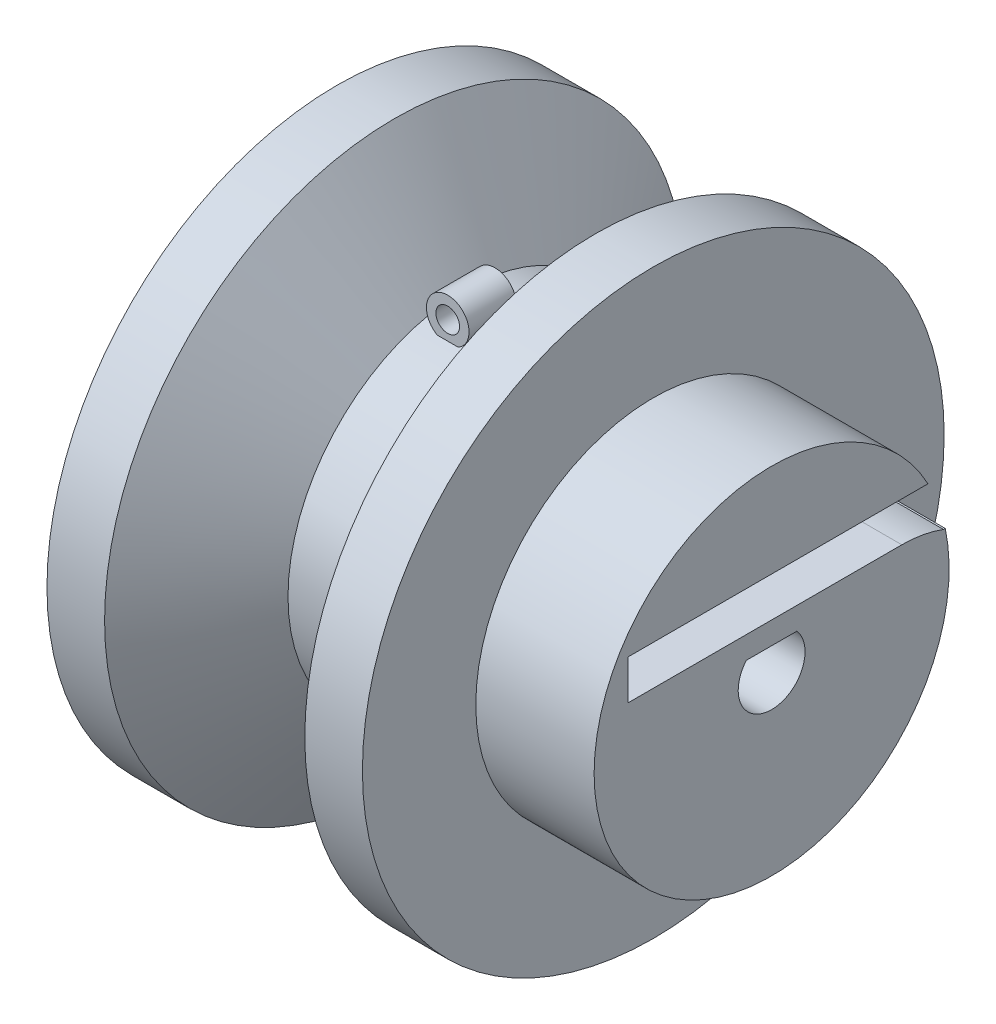
ISO-10303-21;
HEADER;
FILE_DESCRIPTION(('STEP AP214'),'2;1');
FILE_NAME('part.step','',(''),(''),'','','');
FILE_SCHEMA(('AUTOMOTIVE_DESIGN { 1 0 10303 214 1 1 1 1 }'));
ENDSEC;
DATA;
#1=APPLICATION_CONTEXT('core data for automotive mechanical design processes');
#2=APPLICATION_PROTOCOL_DEFINITION('international standard','automotive_design',2000,#1);
#3=PRODUCT_CONTEXT('',#1,'mechanical');
#4=PRODUCT('Part','Part','',(#3));
#5=PRODUCT_RELATED_PRODUCT_CATEGORY('part','',(#4));
#6=PRODUCT_DEFINITION_FORMATION('','',#4);
#7=PRODUCT_DEFINITION_CONTEXT('part definition',#1,'design');
#8=PRODUCT_DEFINITION('design','',#6,#7);
#9=PRODUCT_DEFINITION_SHAPE('','',#8);
#10=(LENGTH_UNIT() NAMED_UNIT(*) SI_UNIT(.MILLI.,.METRE.));
#11=(NAMED_UNIT(*) PLANE_ANGLE_UNIT() SI_UNIT($,.RADIAN.));
#12=(NAMED_UNIT(*) SI_UNIT($,.STERADIAN.) SOLID_ANGLE_UNIT());
#13=UNCERTAINTY_MEASURE_WITH_UNIT(LENGTH_MEASURE(1.E-05),#10,'distance_accuracy_value','');
#14=(GEOMETRIC_REPRESENTATION_CONTEXT(3) GLOBAL_UNCERTAINTY_ASSIGNED_CONTEXT((#13)) GLOBAL_UNIT_ASSIGNED_CONTEXT((#10,
#11,#12)) REPRESENTATION_CONTEXT('',''));
#15=CARTESIAN_POINT('',(0.,0.,0.));
#16=DIRECTION('',(0.,0.,1.));
#17=DIRECTION('',(1.,0.,0.));
#18=AXIS2_PLACEMENT_3D('',#15,#16,#17);
#19=CARTESIAN_POINT('',(27.74,0.,0.));
#20=DIRECTION('',(1.,0.,0.));
#21=DIRECTION('',(0.,0.,-1.));
#22=AXIS2_PLACEMENT_3D('',#19,#20,#21);
#23=PLANE('',#22);
#24=DIRECTION('',(0.,-1.,0.));
#25=VECTOR('',#24,1.);
#26=CARTESIAN_POINT('',(27.74,7.09824209919004,12.1510601448769));
#27=LINE('',#26,#25);
#28=CARTESIAN_POINT('',(27.74,7.09824209919004,12.1510601448769));
#29=VERTEX_POINT('',#28);
#30=CARTESIAN_POINT('',(27.74,3.73881264693587,12.1510601448769));
#31=VERTEX_POINT('',#30);
#32=EDGE_CURVE('E265',#29,#31,#27,.T.);
#33=ORIENTED_EDGE('',*,*,#32,.T.);
#34=DIRECTION('',(0.,0.,1.));
#35=VECTOR('',#34,1.);
#36=CARTESIAN_POINT('',(27.74,3.73881264693587,12.1510601448769));
#37=LINE('',#36,#35);
#38=CARTESIAN_POINT('',(27.74,3.73881264693587,-11.0050547500701));
#39=VERTEX_POINT('',#38);
#40=EDGE_CURVE('E322',#39,#31,#37,.T.);
#41=ORIENTED_EDGE('',*,*,#40,.F.);
#42=CARTESIAN_POINT('',(27.74,-6.26118735306413,-11.0050547500701));
#43=DIRECTION('',(1.,0.,0.));
#44=DIRECTION('',(0.,0.,-1.));
#45=AXIS2_PLACEMENT_3D('',#42,#43,#44);
#46=CIRCLE('',#45,10.);
#47=CARTESIAN_POINT('',(27.74,3.09824209919004,-14.5265715153684));
#48=VERTEX_POINT('',#47);
#49=EDGE_CURVE('E12',#39,#48,#46,.F.);
#50=ORIENTED_EDGE('',*,*,#49,.T.);
#51=DIRECTION('',(0.,0.,-1.));
#52=VECTOR('',#51,1.);
#53=CARTESIAN_POINT('',(27.74,3.09824209919004,12.1510601448769));
#54=LINE('',#53,#52);
#55=CARTESIAN_POINT('',(27.74,3.09824209919004,-14.6765423685147));
#56=VERTEX_POINT('',#55);
#57=EDGE_CURVE('E60',#48,#56,#54,.T.);
#58=ORIENTED_EDGE('',*,*,#57,.T.);
#59=CARTESIAN_POINT('',(27.74,0.,0.));
#60=DIRECTION('',(1.,0.,0.));
#61=DIRECTION('',(0.,0.,-1.));
#62=AXIS2_PLACEMENT_3D('',#59,#60,#61);
#63=CIRCLE('',#62,15.);
#64=CARTESIAN_POINT('',(27.74,3.73881264693587,-14.5265715153684));
#65=VERTEX_POINT('',#64);
#66=EDGE_CURVE('E132',#56,#65,#63,.T.);
#67=ORIENTED_EDGE('',*,*,#66,.T.);
#68=CARTESIAN_POINT('',(27.74,7.09824209919004,-13.2141953633691));
#69=VERTEX_POINT('',#68);
#70=EDGE_CURVE('E251',#65,#69,#63,.T.);
#71=ORIENTED_EDGE('',*,*,#70,.T.);
#72=DIRECTION('',(0.,0.,1.));
#73=VECTOR('',#72,1.);
#74=CARTESIAN_POINT('',(27.74,7.09824209919004,12.1510601448769));
#75=LINE('',#74,#73);
#76=EDGE_CURVE('E256',#69,#29,#75,.T.);
#77=ORIENTED_EDGE('',*,*,#76,.T.);
#78=EDGE_LOOP('',(#33,#41,#50,#58,#67,#71,#77));
#79=FACE_BOUND('',#78,.T.);
#80=ADVANCED_FACE('F45',(#79),#23,.T.);
#81=CARTESIAN_POINT('',(27.74,3.09824209919004,12.1510601448769));
#82=DIRECTION('',(0.,-1.,0.));
#83=DIRECTION('',(0.,0.,-1.));
#84=AXIS2_PLACEMENT_3D('',#81,#82,#83);
#85=PLANE('',#84);
#86=DIRECTION('',(-1.,0.,0.));
#87=VECTOR('',#86,1.);
#88=CARTESIAN_POINT('',(36.74,3.09824209919004,-14.5265715153684));
#89=LINE('',#88,#87);
#90=CARTESIAN_POINT('',(36.74,3.09824209919004,-14.5265715153684));
#91=VERTEX_POINT('',#90);
#92=EDGE_CURVE('E315',#91,#48,#89,.T.);
#93=ORIENTED_EDGE('',*,*,#92,.F.);
#94=DIRECTION('',(0.,0.,-1.));
#95=VECTOR('',#94,1.);
#96=CARTESIAN_POINT('',(36.74,3.09824209919004,12.1510601448769));
#97=LINE('',#96,#95);
#98=CARTESIAN_POINT('',(36.74,3.09824209919004,-14.6765423685147));
#99=VERTEX_POINT('',#98);
#100=EDGE_CURVE('E266',#91,#99,#97,.T.);
#101=ORIENTED_EDGE('',*,*,#100,.T.);
#102=DIRECTION('',(1.,0.,0.));
#103=VECTOR('',#102,1.);
#104=CARTESIAN_POINT('',(27.74,3.09824209919004,-14.6765423685147));
#105=LINE('',#104,#103);
#106=EDGE_CURVE('E273',#56,#99,#105,.T.);
#107=ORIENTED_EDGE('',*,*,#106,.F.);
#108=ORIENTED_EDGE('',*,*,#57,.F.);
#109=EDGE_LOOP('',(#93,#101,#107,#108));
#110=FACE_BOUND('',#109,.T.);
#111=ADVANCED_FACE('F167',(#110),#85,.F.);
#112=CARTESIAN_POINT('',(27.74,7.09824209919004,12.1510601448769));
#113=DIRECTION('',(0.,0.,1.));
#114=DIRECTION('',(1.,0.,0.));
#115=AXIS2_PLACEMENT_3D('',#112,#113,#114);
#116=PLANE('',#115);
#117=DIRECTION('',(-1.,0.,0.));
#118=VECTOR('',#117,1.);
#119=CARTESIAN_POINT('',(36.74,3.73881264693587,12.1510601448769));
#120=LINE('',#119,#118);
#121=CARTESIAN_POINT('',(36.74,3.73881264693587,12.1510601448769));
#122=VERTEX_POINT('',#121);
#123=EDGE_CURVE('E318',#122,#31,#120,.T.);
#124=ORIENTED_EDGE('',*,*,#123,.T.);
#125=ORIENTED_EDGE('',*,*,#32,.F.);
#126=DIRECTION('',(1.,0.,0.));
#127=VECTOR('',#126,1.);
#128=CARTESIAN_POINT('',(27.74,7.09824209919004,12.1510601448769));
#129=LINE('',#128,#127);
#130=CARTESIAN_POINT('',(36.74,7.09824209919004,12.1510601448769));
#131=VERTEX_POINT('',#130);
#132=EDGE_CURVE('E263',#29,#131,#129,.T.);
#133=ORIENTED_EDGE('',*,*,#132,.T.);
#134=DIRECTION('',(0.,-1.,0.));
#135=VECTOR('',#134,1.);
#136=CARTESIAN_POINT('',(36.74,7.09824209919004,12.1510601448769));
#137=LINE('',#136,#135);
#138=EDGE_CURVE('E300',#131,#122,#137,.T.);
#139=ORIENTED_EDGE('',*,*,#138,.T.);
#140=EDGE_LOOP('',(#124,#125,#133,#139));
#141=FACE_BOUND('',#140,.T.);
#142=ADVANCED_FACE('F171',(#141),#116,.F.);
#143=CARTESIAN_POINT('',(-743.156397809563,0.,0.));
#144=DIRECTION('',(-1.,0.,0.));
#145=DIRECTION('',(0.,0.,1.));
#146=AXIS2_PLACEMENT_3D('',#143,#144,#145);
#147=CYLINDRICAL_SURFACE('',#146,15.);
#148=CARTESIAN_POINT('',(15.8700000000001,0.,0.));
#149=DIRECTION('',(-1.,0.,0.));
#150=DIRECTION('',(0.,0.,1.));
#151=AXIS2_PLACEMENT_3D('',#148,#149,#150);
#152=CIRCLE('',#151,15.);
#153=CARTESIAN_POINT('',(15.8700000000001,0.,15.));
#154=VERTEX_POINT('',#153);
#155=EDGE_CURVE('E220',#154,#154,#152,.T.);
#156=ORIENTED_EDGE('',*,*,#155,.T.);
#157=EDGE_LOOP('',(#156));
#158=FACE_BOUND('',#157,.T.);
#159=CARTESIAN_POINT('',(10.87,0.,0.));
#160=DIRECTION('',(-1.,0.,0.));
#161=DIRECTION('',(0.,0.,1.));
#162=AXIS2_PLACEMENT_3D('',#159,#160,#161);
#163=CIRCLE('',#162,15.);
#164=CARTESIAN_POINT('',(10.87,0.,15.));
#165=VERTEX_POINT('',#164);
#166=EDGE_CURVE('E226',#165,#165,#163,.T.);
#167=ORIENTED_EDGE('',*,*,#166,.F.);
#168=EDGE_LOOP('',(#167));
#169=FACE_BOUND('',#168,.T.);
#170=DIRECTION('',(-1.,0.,0.));
#171=VECTOR('',#170,1.);
#172=CARTESIAN_POINT('',(-743.156397809563,15.,0.));
#173=LINE('',#172,#171);
#174=CARTESIAN_POINT('',(14.8504583116479,15.,0.));
#175=VERTEX_POINT('',#174);
#176=CARTESIAN_POINT('',(11.8895416883522,15.,0.));
#177=VERTEX_POINT('',#176);
#178=EDGE_CURVE('E144',#175,#177,#173,.T.);
#179=ORIENTED_EDGE('',*,*,#178,.F.);
#180=CARTESIAN_POINT('',(14.4196866255922,14.5615933194139,-3.6));
#181=CARTESIAN_POINT('',(14.4357733459285,14.5731456355853,-3.55327410404818));
#182=CARTESIAN_POINT('',(14.4510818867125,14.5845327262907,-3.50624724967474));
#183=CARTESIAN_POINT('',(14.4802932805511,14.6069428594248,-3.41168258013151));
#184=CARTESIAN_POINT('',(14.4941964015871,14.617965970985,-3.36414486429099));
#185=CARTESIAN_POINT('',(14.534009145234,14.6504266284674,-3.22095805424617));
#186=CARTESIAN_POINT('',(14.5580496378074,14.6712757325477,-3.12465360524271));
#187=CARTESIAN_POINT('',(14.6019926339957,14.7111796475416,-2.93103098705327));
#188=CARTESIAN_POINT('',(14.6219057918556,14.7302390070361,-2.83371612646438));
#189=CARTESIAN_POINT('',(14.6583436782672,14.7665277583274,-2.63809805101602));
#190=CARTESIAN_POINT('',(14.6748675652217,14.783756695097,-2.53979459701827));
#191=CARTESIAN_POINT('',(14.7202890144841,14.8327309935113,-2.24286251660221));
#192=CARTESIAN_POINT('',(14.7448495147132,14.8615835104745,-2.04308407583506));
#193=CARTESIAN_POINT('',(14.7853552250568,14.9112821235563,-1.64154236759657));
#194=CARTESIAN_POINT('',(14.8012929445319,14.932121253888,-1.43977752893685));
#195=CARTESIAN_POINT('',(14.8241201509908,14.9627865618332,-1.06933809275482));
#196=CARTESIAN_POINT('',(14.8320833390896,14.9738784677839,-0.900831426121393));
#197=CARTESIAN_POINT('',(14.8437857630441,14.9903684014082,-0.563378108900227));
#198=CARTESIAN_POINT('',(14.8475245782457,14.9957658620372,-0.39443141617424));
#199=CARTESIAN_POINT('',(14.8510475053307,15.0008481000002,-0.0562911462323061));
#200=CARTESIAN_POINT('',(14.8508287793075,15.0005287778977,0.112902521146719));
#201=CARTESIAN_POINT('',(14.8464137659677,14.9941687050334,0.451121332644292));
#202=CARTESIAN_POINT('',(14.8422177235624,14.9881283065585,0.620146486497868));
#203=CARTESIAN_POINT('',(14.8295497828135,14.9703508064537,0.957677724063648));
#204=CARTESIAN_POINT('',(14.8210794451633,14.9586157841884,1.12618397466693));
#205=CARTESIAN_POINT('',(14.7992489937467,14.9294971643141,1.46238790541403));
#206=CARTESIAN_POINT('',(14.7858891877359,14.9121139222262,1.63008563577523));
#207=CARTESIAN_POINT('',(14.7533014497415,14.8718181714802,1.96399131090327));
#208=CARTESIAN_POINT('',(14.734082434664,14.8489140758102,2.13020112713187));
#209=CARTESIAN_POINT('',(14.6882736430643,14.7977265549024,2.46073552471884));
#210=CARTESIAN_POINT('',(14.6616871265857,14.7694455106425,2.62506090650605));
#211=CARTESIAN_POINT('',(14.6121293611745,14.7208605118612,2.88191261487692));
#212=CARTESIAN_POINT('',(14.5923920189749,14.7022476730537,2.97538575717802));
#213=CARTESIAN_POINT('',(14.5490457514022,14.6634323901987,3.16113071557196));
#214=CARTESIAN_POINT('',(14.5254360590606,14.6432296316604,3.25340228976305));
#215=CARTESIAN_POINT('',(14.4736438573016,14.6014901133968,3.43587025869111));
#216=CARTESIAN_POINT('',(14.4454833495709,14.579960065913,3.52607436544581));
#217=CARTESIAN_POINT('',(14.3834124892646,14.5357336262286,3.70416635284676));
#218=CARTESIAN_POINT('',(14.3495057749706,14.5130379783405,3.79205565870366));
#219=CARTESIAN_POINT('',(14.2816632781307,14.4713782459583,3.94770627141876));
#220=CARTESIAN_POINT('',(14.2490147605012,14.4525465348298,4.0160587569922));
#221=CARTESIAN_POINT('',(14.1776736014055,14.4147066922762,4.14982705511399));
#222=CARTESIAN_POINT('',(14.1389636389636,14.3956982068336,4.2152337379752));
#223=CARTESIAN_POINT('',(14.053496716524,14.3579883612102,4.34195676302697));
#224=CARTESIAN_POINT('',(14.0066493318362,14.3392933633049,4.40321505127815));
#225=CARTESIAN_POINT('',(13.9031280258792,14.303734624538,4.51737619906335));
#226=CARTESIAN_POINT('',(13.846508047841,14.2868616167521,4.57032202941811));
#227=CARTESIAN_POINT('',(13.7538071876932,14.2649614250336,4.63804211187079));
#228=CARTESIAN_POINT('',(13.7222225498666,14.2583171304529,4.65840748477789));
#229=CARTESIAN_POINT('',(13.6562774506016,14.2464328041472,4.69462577561884));
#230=CARTESIAN_POINT('',(13.621918209352,14.2411921594685,4.71048066340542));
#231=CARTESIAN_POINT('',(13.5504019857745,14.2325355008809,4.73657354696612));
#232=CARTESIAN_POINT('',(13.5132175374748,14.2291410046089,4.74674533966798));
#233=CARTESIAN_POINT('',(13.4374766421934,14.2247048043685,4.76002375755702));
#234=CARTESIAN_POINT('',(13.3989221584986,14.2236598614183,4.76314010907888));
#235=CARTESIAN_POINT('',(13.3265433801891,14.2240416844005,4.76199912942318));
#236=CARTESIAN_POINT('',(13.2927014760983,14.2251894584282,4.75857410952));
#237=CARTESIAN_POINT('',(13.2261282537126,14.2292858549023,4.74631066930553));
#238=CARTESIAN_POINT('',(13.1933977538552,14.2322357753385,4.73746834718721));
#239=CARTESIAN_POINT('',(13.1211769970377,14.2406540659488,4.7121111450922));
#240=CARTESIAN_POINT('',(13.0822476287741,14.2465873657808,4.69416928782727));
#241=CARTESIAN_POINT('',(13.0079220608542,14.260223210777,4.65258152523016));
#242=CARTESIAN_POINT('',(12.9725332261644,14.2679293382855,4.62892406548383));
#243=CARTESIAN_POINT('',(12.8847486219253,14.2895789372695,4.56177638610586));
#244=CARTESIAN_POINT('',(12.835136679505,14.3044609626683,4.51498763066536));
#245=CARTESIAN_POINT('',(12.743567487068,14.335664733547,4.41491719805999));
#246=CARTESIAN_POINT('',(12.701631614679,14.3519903174951,4.36161805693269));
#247=CARTESIAN_POINT('',(12.6233877354781,14.3854233287487,4.2500634129974));
#248=CARTESIAN_POINT('',(12.5871735150634,14.402538807598,4.19174558982209));
#249=CARTESIAN_POINT('',(12.5198688154969,14.4367955791711,4.07219972382445));
#250=CARTESIAN_POINT('',(12.4887837574,14.4539368801275,4.01096868892336));
#251=CARTESIAN_POINT('',(12.4307756097092,14.4879377181199,3.88636597281732));
#252=CARTESIAN_POINT('',(12.4038603287389,14.5047966750173,3.82299053981944));
#253=CARTESIAN_POINT('',(12.3535581461621,14.5379871897917,3.6947687926762));
#254=CARTESIAN_POINT('',(12.3301697500174,14.5543189687445,3.62992311503232));
#255=CARTESIAN_POINT('',(12.2753494471734,14.5943593022677,3.46625127093833));
#256=CARTESIAN_POINT('',(12.2457718561926,14.617656382878,3.36670461770813));
#257=CARTESIAN_POINT('',(12.1918923665254,14.6624835793699,3.16578371416132));
#258=CARTESIAN_POINT('',(12.1675928786928,14.6840128850126,3.06440865149127));
#259=CARTESIAN_POINT('',(12.1232668895811,14.7251564150388,2.86018087887823));
#260=CARTESIAN_POINT('',(12.1032471176801,14.7447675975036,2.75732610934127));
#261=CARTESIAN_POINT('',(12.0667974784765,14.7819295338732,2.55060724695809));
#262=CARTESIAN_POINT('',(12.0503681883555,14.7994799562947,2.4467429946331));
#263=CARTESIAN_POINT('',(12.0054117988238,14.8491327088046,2.13268390490919));
#264=CARTESIAN_POINT('',(11.9814780057331,14.8779771692141,1.92130520353029));
#265=CARTESIAN_POINT('',(11.9427220872583,14.9266483223394,1.49692522716866));
#266=CARTESIAN_POINT('',(11.9278921176987,14.9464827745529,1.28392550959538));
#267=CARTESIAN_POINT('',(11.907952155789,14.9737758578702,0.902442311576138));
#268=CARTESIAN_POINT('',(11.9014438057765,14.9829716196496,0.734151667077948));
#269=CARTESIAN_POINT('',(11.8925128386671,14.9956870181089,0.397230797384605));
#270=CARTESIAN_POINT('',(11.8900906331622,14.999206082981,0.228600539693301));
#271=CARTESIAN_POINT('',(11.8891578517171,15.0005551932647,-0.108920039445438));
#272=CARTESIAN_POINT('',(11.8906525557944,14.9983775594991,-0.277810404903986));
#273=CARTESIAN_POINT('',(11.8976714953338,14.9883245511582,-0.615328177293033));
#274=CARTESIAN_POINT('',(11.9031954494973,14.9804495743383,-0.783955601756987));
#275=CARTESIAN_POINT('',(11.9186031445197,14.9591218424272,-1.1192168677703));
#276=CARTESIAN_POINT('',(11.9284493676455,14.9457171449308,-1.28585545956366));
#277=CARTESIAN_POINT('',(11.9531985053103,14.9133913628383,-1.61821739119074));
#278=CARTESIAN_POINT('',(11.9681010247495,14.8944707092763,-1.78394080150894));
#279=CARTESIAN_POINT('',(12.0040418346158,14.8512557634159,-2.1137196110568));
#280=CARTESIAN_POINT('',(12.0250690881903,14.8269711558943,-2.27777746608642));
#281=CARTESIAN_POINT('',(12.0749081604676,14.7731989837949,-2.60381323195979));
#282=CARTESIAN_POINT('',(12.1037157789666,14.7437142294701,-2.76579221579594));
#283=CARTESIAN_POINT('',(12.1497886574595,14.7004505854281,-2.98331277780519));
#284=CARTESIAN_POINT('',(12.1625451980696,14.6887806656528,-3.04024374783667));
#285=CARTESIAN_POINT('',(12.1895359675838,14.6648557581363,-3.15362650436627));
#286=CARTESIAN_POINT('',(12.2037700368106,14.6526008336941,-3.21007834193263));
#287=CARTESIAN_POINT('',(12.2339234510703,14.6275147826492,-3.32251911212986));
#288=CARTESIAN_POINT('',(12.2498458100237,14.6146826499476,-3.37850701779111));
#289=CARTESIAN_POINT('',(12.2835937750028,14.5885079767889,-3.48980115988623));
#290=CARTESIAN_POINT('',(12.3014198876024,14.5751653010894,-3.54510721049505));
#291=CARTESIAN_POINT('',(12.3203133744079,14.5615933194139,-3.60000000000001));
#292=B_SPLINE_CURVE_WITH_KNOTS('',3,(#180,#181,#182,#183,#184,#185,#186,#187,#188,#189,#190,
#191,#192,#193,#194,#195,#196,#197,#198,#199,#200,#201,#202,#203,#204,#205,#206,#207,#208,#209,
#210,#211,#212,#213,#214,#215,#216,#217,#218,#219,#220,#221,#222,#223,#224,#225,#226,#227,#228,
#229,#230,#231,#232,#233,#234,#235,#236,#237,#238,#239,#240,#241,#242,#243,#244,#245,#246,#247,
#248,#249,#250,#251,#252,#253,#254,#255,#256,#257,#258,#259,#260,#261,#262,#263,#264,#265,#266,
#267,#268,#269,#270,#271,#272,#273,#274,#275,#276,#277,#278,#279,#280,#281,#282,#283,#284,#285,
#286,#287,#288,#289,#290,#291),.UNSPECIFIED.,.F.,.F.,(4,2,2,2,2,2,2,2,2,2,2,2,2,2,2,2,2,2,2,2,2,
2,2,2,2,2,2,2,2,2,2,2,2,2,2,2,2,2,2,2,2,2,2,2,2,2,2,2,2,2,2,2,2,2,2,4),(0.,0.152231087412707,
0.304433092888874,0.608571886148284,0.911915523369458,1.21533439358123,1.8248948761157,
2.43498403915777,2.94201027403547,3.44908699308285,3.95652734534077,4.46393645297392,
4.97116042186448,5.47835247027026,5.98477646337416,6.49097672590164,6.78289168353585,
7.07486452864415,7.36546583771055,7.65588383174659,7.88983944187351,8.12447622435749,
8.36191003005974,8.59807286668877,8.71225729703896,8.82639178308892,8.94182950224893,
9.05710798666945,9.1586861697069,9.26033760048964,9.38943463515293,9.51879486322006,
9.72701473586305,9.93580595324616,10.1477270024573,10.3598706176915,10.5724068272348,
10.7848527186724,11.1039215172717,11.4231357503452,11.7428482794019,12.0626121655265,
12.7061331919394,13.3490989568068,13.8549572472993,14.3608664891818,14.867458050437,
15.3740142478154,15.876257843219,16.3784622022561,16.8797671226675,17.3808019543838,
17.5592793268888,17.7377374313018,17.9165196595065,18.0953495793641),.UNSPECIFIED.);
#293=CARTESIAN_POINT('',(14.2557170803749,14.456832294801,4.));
#294=VERTEX_POINT('',#293);
#295=EDGE_CURVE('E137',#175,#294,#292,.T.);
#296=ORIENTED_EDGE('',*,*,#295,.T.);
#297=DIRECTION('',(-1.,0.,0.));
#298=VECTOR('',#297,1.);
#299=CARTESIAN_POINT('',(-743.156397809563,14.456832294801,4.));
#300=LINE('',#299,#298);
#301=CARTESIAN_POINT('',(12.4842829196252,14.456832294801,4.));
#302=VERTEX_POINT('',#301);
#303=EDGE_CURVE('E123',#294,#302,#300,.T.);
#304=ORIENTED_EDGE('',*,*,#303,.T.);
#305=EDGE_CURVE('E131',#302,#177,#292,.T.);
#306=ORIENTED_EDGE('',*,*,#305,.T.);
#307=EDGE_LOOP('',(#179,#296,#304,#306));
#308=FACE_BOUND('',#307,.T.);
#309=ADVANCED_FACE('F143',(#158,#169,#308),#147,.T.);
#310=CARTESIAN_POINT('',(0.,0.,0.));
#311=DIRECTION('',(1.,0.,0.));
#312=DIRECTION('',(0.,0.,-1.));
#313=AXIS2_PLACEMENT_3D('',#310,#311,#312);
#314=PLANE('',#313);
#315=CARTESIAN_POINT('',(0.,0.,0.));
#316=DIRECTION('',(-1.,0.,0.));
#317=DIRECTION('',(0.,0.,1.));
#318=AXIS2_PLACEMENT_3D('',#315,#316,#317);
#319=CIRCLE('',#318,24.5);
#320=CARTESIAN_POINT('',(0.,0.,24.5));
#321=VERTEX_POINT('',#320);
#322=EDGE_CURVE('E238',#321,#321,#319,.T.);
#323=ORIENTED_EDGE('',*,*,#322,.T.);
#324=EDGE_LOOP('',(#323));
#325=FACE_BOUND('',#324,.T.);
#326=ADVANCED_FACE('F431',(#325),#314,.F.);
#327=CARTESIAN_POINT('',(-743.156397809563,0.,0.));
#328=DIRECTION('',(-1.,0.,0.));
#329=DIRECTION('',(0.,0.,1.));
#330=AXIS2_PLACEMENT_3D('',#327,#328,#329);
#331=CYLINDRICAL_SURFACE('',#330,24.5);
#332=ORIENTED_EDGE('',*,*,#322,.F.);
#333=EDGE_LOOP('',(#332));
#334=FACE_BOUND('',#333,.T.);
#335=CARTESIAN_POINT('',(4.87000000000004,0.,0.));
#336=DIRECTION('',(-1.,0.,0.));
#337=DIRECTION('',(0.,0.,1.));
#338=AXIS2_PLACEMENT_3D('',#335,#336,#337);
#339=CIRCLE('',#338,24.5);
#340=CARTESIAN_POINT('',(4.87000000000004,0.,24.5));
#341=VERTEX_POINT('',#340);
#342=EDGE_CURVE('E235',#341,#341,#339,.T.);
#343=ORIENTED_EDGE('',*,*,#342,.T.);
#344=EDGE_LOOP('',(#343));
#345=FACE_BOUND('',#344,.T.);
#346=ADVANCED_FACE('F215',(#334,#345),#331,.T.);
#347=CARTESIAN_POINT('',(10.87,0.,0.));
#348=DIRECTION('',(-1.,0.,0.));
#349=DIRECTION('',(0.,0.,1.));
#350=AXIS2_PLACEMENT_3D('',#347,#348,#349);
#351=CONICAL_SURFACE('',#350,15.,1.00748006530293);
#352=ORIENTED_EDGE('',*,*,#342,.F.);
#353=EDGE_LOOP('',(#352));
#354=FACE_BOUND('',#353,.T.);
#355=ORIENTED_EDGE('',*,*,#166,.T.);
#356=EDGE_LOOP('',(#355));
#357=FACE_BOUND('',#356,.T.);
#358=ADVANCED_FACE('F210',(#354,#357),#351,.T.);
#359=CARTESIAN_POINT('',(21.8699999999999,0.,0.));
#360=DIRECTION('',(1.,0.,0.));
#361=DIRECTION('',(0.,0.,-1.));
#362=AXIS2_PLACEMENT_3D('',#359,#360,#361);
#363=CONICAL_SURFACE('',#362,24.5811415525114,1.01131287661842);
#364=ORIENTED_EDGE('',*,*,#155,.F.);
#365=EDGE_LOOP('',(#364));
#366=FACE_BOUND('',#365,.T.);
#367=CARTESIAN_POINT('',(21.8699999999999,0.,0.));
#368=DIRECTION('',(-1.,0.,0.));
#369=DIRECTION('',(0.,0.,1.));
#370=AXIS2_PLACEMENT_3D('',#367,#368,#369);
#371=CIRCLE('',#370,24.5811415525114);
#372=CARTESIAN_POINT('',(21.8699999999999,0.,24.5811415525114));
#373=VERTEX_POINT('',#372);
#374=EDGE_CURVE('E223',#373,#373,#371,.T.);
#375=ORIENTED_EDGE('',*,*,#374,.T.);
#376=EDGE_LOOP('',(#375));
#377=FACE_BOUND('',#376,.T.);
#378=ADVANCED_FACE('F207',(#366,#377),#363,.T.);
#379=CARTESIAN_POINT('',(-743.156397809563,0.,0.));
#380=DIRECTION('',(-1.,0.,0.));
#381=DIRECTION('',(0.,0.,1.));
#382=AXIS2_PLACEMENT_3D('',#379,#380,#381);
#383=CYLINDRICAL_SURFACE('',#382,24.5811415525114);
#384=ORIENTED_EDGE('',*,*,#374,.F.);
#385=EDGE_LOOP('',(#384));
#386=FACE_BOUND('',#385,.T.);
#387=CARTESIAN_POINT('',(26.74,0.,0.));
#388=DIRECTION('',(-1.,0.,0.));
#389=DIRECTION('',(0.,0.,1.));
#390=AXIS2_PLACEMENT_3D('',#387,#388,#389);
#391=CIRCLE('',#390,24.5811415525114);
#392=CARTESIAN_POINT('',(26.74,0.,24.5811415525114));
#393=VERTEX_POINT('',#392);
#394=EDGE_CURVE('E224',#393,#393,#391,.T.);
#395=ORIENTED_EDGE('',*,*,#394,.T.);
#396=EDGE_LOOP('',(#395));
#397=FACE_BOUND('',#396,.T.);
#398=ADVANCED_FACE('F204',(#386,#397),#383,.T.);
#399=CARTESIAN_POINT('',(26.74,24.5811415525114,0.));
#400=DIRECTION('',(-1.,0.,0.));
#401=DIRECTION('',(0.,0.,1.));
#402=AXIS2_PLACEMENT_3D('',#399,#400,#401);
#403=PLANE('',#402);
#404=ORIENTED_EDGE('',*,*,#394,.F.);
#405=EDGE_LOOP('',(#404));
#406=FACE_BOUND('',#405,.T.);
#407=CARTESIAN_POINT('',(26.74,0.,0.));
#408=DIRECTION('',(-1.,0.,0.));
#409=DIRECTION('',(0.,0.,1.));
#410=AXIS2_PLACEMENT_3D('',#407,#408,#409);
#411=CIRCLE('',#410,15.);
#412=CARTESIAN_POINT('',(26.74,0.,15.));
#413=VERTEX_POINT('',#412);
#414=EDGE_CURVE('E229',#413,#413,#411,.T.);
#415=ORIENTED_EDGE('',*,*,#414,.T.);
#416=EDGE_LOOP('',(#415));
#417=FACE_BOUND('',#416,.T.);
#418=ADVANCED_FACE('F200',(#406,#417),#403,.F.);
#419=CARTESIAN_POINT('',(-743.156397809563,0.,0.));
#420=DIRECTION('',(-1.,0.,0.));
#421=DIRECTION('',(0.,0.,1.));
#422=AXIS2_PLACEMENT_3D('',#419,#420,#421);
#423=CYLINDRICAL_SURFACE('',#422,15.);
#424=ORIENTED_EDGE('',*,*,#414,.F.);
#425=EDGE_LOOP('',(#424));
#426=FACE_BOUND('',#425,.T.);
#427=ORIENTED_EDGE('',*,*,#66,.F.);
#428=ORIENTED_EDGE('',*,*,#106,.T.);
#429=CARTESIAN_POINT('',(36.74,0.,0.));
#430=DIRECTION('',(-1.,0.,0.));
#431=DIRECTION('',(0.,0.,1.));
#432=AXIS2_PLACEMENT_3D('',#429,#430,#431);
#433=CIRCLE('',#432,15.);
#434=CARTESIAN_POINT('',(36.74,7.09824209919004,-13.2141953633691));
#435=VERTEX_POINT('',#434);
#436=EDGE_CURVE('E271',#99,#435,#433,.T.);
#437=ORIENTED_EDGE('',*,*,#436,.T.);
#438=DIRECTION('',(-1.,0.,0.));
#439=VECTOR('',#438,1.);
#440=CARTESIAN_POINT('',(-743.156397809563,7.09824209919004,-13.2141953633691));
#441=LINE('',#440,#439);
#442=EDGE_CURVE('E261',#435,#69,#441,.T.);
#443=ORIENTED_EDGE('',*,*,#442,.T.);
#444=ORIENTED_EDGE('',*,*,#70,.F.);
#445=EDGE_LOOP('',(#427,#428,#437,#443,#444));
#446=FACE_BOUND('',#445,.T.);
#447=ADVANCED_FACE('F197',(#426,#446),#423,.T.);
#448=CARTESIAN_POINT('',(36.74,15.,0.));
#449=DIRECTION('',(-1.,0.,0.));
#450=DIRECTION('',(0.,0.,1.));
#451=AXIS2_PLACEMENT_3D('',#448,#449,#450);
#452=PLANE('',#451);
#453=ORIENTED_EDGE('',*,*,#100,.F.);
#454=CARTESIAN_POINT('',(36.74,-6.26118735306413,-11.0050547500701));
#455=DIRECTION('',(-1.,0.,0.));
#456=DIRECTION('',(0.,0.,1.));
#457=AXIS2_PLACEMENT_3D('',#454,#455,#456);
#458=CIRCLE('',#457,10.);
#459=CARTESIAN_POINT('',(36.74,3.73881264693587,-11.0050547500701));
#460=VERTEX_POINT('',#459);
#461=EDGE_CURVE('E53',#91,#460,#458,.F.);
#462=ORIENTED_EDGE('',*,*,#461,.T.);
#463=DIRECTION('',(0.,0.,1.));
#464=VECTOR('',#463,1.);
#465=CARTESIAN_POINT('',(36.74,3.73881264693587,12.1510601448769));
#466=LINE('',#465,#464);
#467=EDGE_CURVE('E321',#460,#122,#466,.T.);
#468=ORIENTED_EDGE('',*,*,#467,.T.);
#469=ORIENTED_EDGE('',*,*,#138,.F.);
#470=DIRECTION('',(0.,0.,-1.));
#471=VECTOR('',#470,1.);
#472=CARTESIAN_POINT('',(36.74,7.09824209919004,0.));
#473=LINE('',#472,#471);
#474=EDGE_CURVE('E249',#131,#435,#473,.T.);
#475=ORIENTED_EDGE('',*,*,#474,.T.);
#476=ORIENTED_EDGE('',*,*,#436,.F.);
#477=EDGE_LOOP('',(#453,#462,#468,#469,#475,#476));
#478=FACE_BOUND('',#477,.T.);
#479=DIRECTION('',(0.,0.,-1.));
#480=VECTOR('',#479,1.);
#481=CARTESIAN_POINT('',(36.74,1.85097792377277,2.60998384332674));
#482=LINE('',#481,#480);
#483=CARTESIAN_POINT('',(36.74,1.85097792377277,2.13412879782497));
#484=VERTEX_POINT('',#483);
#485=CARTESIAN_POINT('',(36.74,1.85097792377277,-2.13412879782497));
#486=VERTEX_POINT('',#485);
#487=EDGE_CURVE('E272',#484,#486,#482,.T.);
#488=ORIENTED_EDGE('',*,*,#487,.T.);
#489=CARTESIAN_POINT('',(36.74,0.,0.));
#490=DIRECTION('',(1.,0.,0.));
#491=DIRECTION('',(0.,0.,-1.));
#492=AXIS2_PLACEMENT_3D('',#489,#490,#491);
#493=CIRCLE('',#492,2.825);
#494=EDGE_CURVE('E282',#484,#486,#493,.T.);
#495=ORIENTED_EDGE('',*,*,#494,.F.);
#496=EDGE_LOOP('',(#488,#495));
#497=FACE_BOUND('',#496,.T.);
#498=ADVANCED_FACE('F193',(#478,#497),#452,.F.);
#499=CARTESIAN_POINT('',(1.74,0.,0.));
#500=DIRECTION('',(1.,0.,0.));
#501=DIRECTION('',(0.,0.,-1.));
#502=AXIS2_PLACEMENT_3D('',#499,#500,#501);
#503=CYLINDRICAL_SURFACE('',#502,2.825);
#504=ORIENTED_EDGE('',*,*,#494,.T.);
#505=DIRECTION('',(1.,0.,0.));
#506=VECTOR('',#505,1.);
#507=CARTESIAN_POINT('',(1.74,1.85097792377277,-2.13412879782497));
#508=LINE('',#507,#506);
#509=CARTESIAN_POINT('',(6.74,1.85097792377277,-2.13412879782497));
#510=VERTEX_POINT('',#509);
#511=EDGE_CURVE('E246',#486,#510,#508,.F.);
#512=ORIENTED_EDGE('',*,*,#511,.T.);
#513=CARTESIAN_POINT('',(6.74,0.,0.));
#514=DIRECTION('',(1.,0.,0.));
#515=DIRECTION('',(0.,0.,-1.));
#516=AXIS2_PLACEMENT_3D('',#513,#514,#515);
#517=CIRCLE('',#516,2.825);
#518=CARTESIAN_POINT('',(6.74,1.85097792377277,2.13412879782497));
#519=VERTEX_POINT('',#518);
#520=EDGE_CURVE('E241',#519,#510,#517,.F.);
#521=ORIENTED_EDGE('',*,*,#520,.F.);
#522=DIRECTION('',(1.,0.,0.));
#523=VECTOR('',#522,1.);
#524=CARTESIAN_POINT('',(1.74,1.85097792377277,2.13412879782497));
#525=LINE('',#524,#523);
#526=EDGE_CURVE('E243',#519,#484,#525,.T.);
#527=ORIENTED_EDGE('',*,*,#526,.T.);
#528=EDGE_LOOP('',(#504,#512,#521,#527));
#529=FACE_BOUND('',#528,.T.);
#530=CARTESIAN_POINT('',(1.74,0.,0.));
#531=DIRECTION('',(1.,0.,0.));
#532=DIRECTION('',(0.,0.,-1.));
#533=AXIS2_PLACEMENT_3D('',#530,#531,#532);
#534=CIRCLE('',#533,2.825);
#535=CARTESIAN_POINT('',(1.74,0.,-2.825));
#536=VERTEX_POINT('',#535);
#537=EDGE_CURVE('E284',#536,#536,#534,.T.);
#538=ORIENTED_EDGE('',*,*,#537,.F.);
#539=EDGE_LOOP('',(#538));
#540=FACE_BOUND('',#539,.T.);
#541=ADVANCED_FACE('F189',(#529,#540),#503,.F.);
#542=CARTESIAN_POINT('',(1.74,0.,0.));
#543=DIRECTION('',(1.,0.,0.));
#544=DIRECTION('',(0.,0.,-1.));
#545=AXIS2_PLACEMENT_3D('',#542,#543,#544);
#546=PLANE('',#545);
#547=ORIENTED_EDGE('',*,*,#537,.T.);
#548=EDGE_LOOP('',(#547));
#549=FACE_BOUND('',#548,.T.);
#550=ADVANCED_FACE('F185',(#549),#546,.T.);
#551=CARTESIAN_POINT('',(6.74,1.85097792377277,2.60998384332674));
#552=DIRECTION('',(0.,-1.,0.));
#553=DIRECTION('',(0.,0.,-1.));
#554=AXIS2_PLACEMENT_3D('',#551,#552,#553);
#555=PLANE('',#554);
#556=ORIENTED_EDGE('',*,*,#511,.F.);
#557=ORIENTED_EDGE('',*,*,#487,.F.);
#558=ORIENTED_EDGE('',*,*,#526,.F.);
#559=DIRECTION('',(0.,0.,-1.));
#560=VECTOR('',#559,1.);
#561=CARTESIAN_POINT('',(6.74,1.85097792377277,2.60998384332674));
#562=LINE('',#561,#560);
#563=EDGE_CURVE('E276',#519,#510,#562,.T.);
#564=ORIENTED_EDGE('',*,*,#563,.T.);
#565=EDGE_LOOP('',(#556,#557,#558,#564));
#566=FACE_BOUND('',#565,.T.);
#567=ADVANCED_FACE('F181',(#566),#555,.T.);
#568=CARTESIAN_POINT('',(6.74,0.,0.));
#569=DIRECTION('',(1.,0.,0.));
#570=DIRECTION('',(0.,0.,-1.));
#571=AXIS2_PLACEMENT_3D('',#568,#569,#570);
#572=PLANE('',#571);
#573=ORIENTED_EDGE('',*,*,#520,.T.);
#574=ORIENTED_EDGE('',*,*,#563,.F.);
#575=EDGE_LOOP('',(#573,#574));
#576=FACE_BOUND('',#575,.T.);
#577=ADVANCED_FACE('F177',(#576),#572,.F.);
#578=CARTESIAN_POINT('',(27.74,7.09824209919004,12.1510601448769));
#579=DIRECTION('',(0.,1.,0.));
#580=DIRECTION('',(0.,0.,1.));
#581=AXIS2_PLACEMENT_3D('',#578,#579,#580);
#582=PLANE('',#581);
#583=CARTESIAN_POINT('',(31.5456670460605,7.09824209919004,0.));
#584=DIRECTION('',(0.,1.,0.));
#585=DIRECTION('',(0.,0.,1.));
#586=AXIS2_PLACEMENT_3D('',#583,#584,#585);
#587=CIRCLE('',#586,1.43);
#588=CARTESIAN_POINT('',(31.5456670460605,7.09824209919004,1.43));
#589=VERTEX_POINT('',#588);
#590=EDGE_CURVE('E311',#589,#589,#587,.T.);
#591=ORIENTED_EDGE('',*,*,#590,.T.);
#592=EDGE_LOOP('',(#591));
#593=FACE_BOUND('',#592,.T.);
#594=ORIENTED_EDGE('',*,*,#474,.F.);
#595=ORIENTED_EDGE('',*,*,#132,.F.);
#596=ORIENTED_EDGE('',*,*,#76,.F.);
#597=ORIENTED_EDGE('',*,*,#442,.F.);
#598=EDGE_LOOP('',(#594,#595,#596,#597));
#599=FACE_BOUND('',#598,.T.);
#600=ADVANCED_FACE('F163',(#593,#599),#582,.F.);
#601=CARTESIAN_POINT('',(13.37,16.0238374809865,0.));
#602=DIRECTION('',(0.,0.,1.));
#603=DIRECTION('',(1.,0.,0.));
#604=AXIS2_PLACEMENT_3D('',#601,#602,#603);
#605=CYLINDRICAL_SURFACE('',#604,1.8);
#606=ORIENTED_EDGE('',*,*,#295,.F.);
#607=CARTESIAN_POINT('',(13.37,16.0238374809865,0.));
#608=DIRECTION('',(0.,0.,1.));
#609=DIRECTION('',(1.,0.,0.));
#610=AXIS2_PLACEMENT_3D('',#607,#608,#609);
#611=CIRCLE('',#610,1.8);
#612=EDGE_CURVE('E303',#175,#177,#611,.T.);
#613=ORIENTED_EDGE('',*,*,#612,.T.);
#614=ORIENTED_EDGE('',*,*,#305,.F.);
#615=CARTESIAN_POINT('',(13.37,16.0238374809865,4.));
#616=DIRECTION('',(0.,0.,1.));
#617=DIRECTION('',(1.,0.,0.));
#618=AXIS2_PLACEMENT_3D('',#615,#616,#617);
#619=CIRCLE('',#618,1.8);
#620=EDGE_CURVE('E126',#294,#302,#619,.T.);
#621=ORIENTED_EDGE('',*,*,#620,.F.);
#622=EDGE_LOOP('',(#606,#613,#614,#621));
#623=FACE_BOUND('',#622,.T.);
#624=ADVANCED_FACE('F135',(#623),#605,.T.);
#625=CARTESIAN_POINT('',(13.37,16.0238374809865,0.));
#626=DIRECTION('',(0.,0.,1.));
#627=DIRECTION('',(1.,0.,0.));
#628=AXIS2_PLACEMENT_3D('',#625,#626,#627);
#629=PLANE('',#628);
#630=CARTESIAN_POINT('',(13.37,16.0238374809865,0.));
#631=DIRECTION('',(0.,0.,1.));
#632=DIRECTION('',(1.,0.,0.));
#633=AXIS2_PLACEMENT_3D('',#630,#631,#632);
#634=CIRCLE('',#633,1.);
#635=CARTESIAN_POINT('',(14.37,16.0238374809865,0.));
#636=VERTEX_POINT('',#635);
#637=EDGE_CURVE('E139',#636,#636,#634,.T.);
#638=ORIENTED_EDGE('',*,*,#637,.T.);
#639=EDGE_LOOP('',(#638));
#640=FACE_BOUND('',#639,.T.);
#641=ORIENTED_EDGE('',*,*,#612,.F.);
#642=ORIENTED_EDGE('',*,*,#178,.T.);
#643=EDGE_LOOP('',(#641,#642));
#644=FACE_BOUND('',#643,.T.);
#645=ADVANCED_FACE('F162',(#640,#644),#629,.F.);
#646=CARTESIAN_POINT('',(13.37,16.0238374809865,4.));
#647=DIRECTION('',(0.,0.,1.));
#648=DIRECTION('',(1.,0.,0.));
#649=AXIS2_PLACEMENT_3D('',#646,#647,#648);
#650=PLANE('',#649);
#651=CARTESIAN_POINT('',(13.37,16.0238374809865,4.));
#652=DIRECTION('',(0.,0.,1.));
#653=DIRECTION('',(1.,0.,0.));
#654=AXIS2_PLACEMENT_3D('',#651,#652,#653);
#655=CIRCLE('',#654,1.);
#656=CARTESIAN_POINT('',(14.37,16.0238374809865,4.));
#657=VERTEX_POINT('',#656);
#658=EDGE_CURVE('E140',#657,#657,#655,.T.);
#659=ORIENTED_EDGE('',*,*,#658,.F.);
#660=EDGE_LOOP('',(#659));
#661=FACE_BOUND('',#660,.T.);
#662=ORIENTED_EDGE('',*,*,#303,.F.);
#663=ORIENTED_EDGE('',*,*,#620,.T.);
#664=EDGE_LOOP('',(#662,#663));
#665=FACE_BOUND('',#664,.T.);
#666=ADVANCED_FACE('F125',(#661,#665),#650,.T.);
#667=CARTESIAN_POINT('',(13.37,16.0238374809865,0.));
#668=DIRECTION('',(0.,0.,1.));
#669=DIRECTION('',(1.,0.,0.));
#670=AXIS2_PLACEMENT_3D('',#667,#668,#669);
#671=CYLINDRICAL_SURFACE('',#670,1.);
#672=ORIENTED_EDGE('',*,*,#637,.F.);
#673=EDGE_LOOP('',(#672));
#674=FACE_BOUND('',#673,.T.);
#675=ORIENTED_EDGE('',*,*,#658,.T.);
#676=EDGE_LOOP('',(#675));
#677=FACE_BOUND('',#676,.T.);
#678=ADVANCED_FACE('F339',(#674,#677),#671,.F.);
#679=CARTESIAN_POINT('',(31.5456670460605,5.,0.));
#680=DIRECTION('',(0.,1.,0.));
#681=DIRECTION('',(0.,0.,1.));
#682=AXIS2_PLACEMENT_3D('',#679,#680,#681);
#683=CYLINDRICAL_SURFACE('',#682,1.43);
#684=CARTESIAN_POINT('',(31.5456670460605,12.,0.));
#685=DIRECTION('',(0.,1.,0.));
#686=DIRECTION('',(0.,0.,1.));
#687=AXIS2_PLACEMENT_3D('',#684,#685,#686);
#688=CIRCLE('',#687,1.43);
#689=CARTESIAN_POINT('',(31.5456670460605,12.,1.43));
#690=VERTEX_POINT('',#689);
#691=EDGE_CURVE('E312',#690,#690,#688,.T.);
#692=ORIENTED_EDGE('',*,*,#691,.T.);
#693=EDGE_LOOP('',(#692));
#694=FACE_BOUND('',#693,.T.);
#695=ORIENTED_EDGE('',*,*,#590,.F.);
#696=EDGE_LOOP('',(#695));
#697=FACE_BOUND('',#696,.T.);
#698=ADVANCED_FACE('F336',(#694,#697),#683,.F.);
#699=CARTESIAN_POINT('',(31.5456670460605,12.,0.));
#700=DIRECTION('',(0.,1.,0.));
#701=DIRECTION('',(0.,0.,1.));
#702=AXIS2_PLACEMENT_3D('',#699,#700,#701);
#703=PLANE('',#702);
#704=ORIENTED_EDGE('',*,*,#691,.F.);
#705=EDGE_LOOP('',(#704));
#706=FACE_BOUND('',#705,.T.);
#707=ADVANCED_FACE('F338',(#706),#703,.F.);
#708=CARTESIAN_POINT('',(36.74,3.73881264693587,12.1510601448769));
#709=DIRECTION('',(0.,-1.,0.));
#710=DIRECTION('',(0.,0.,-1.));
#711=AXIS2_PLACEMENT_3D('',#708,#709,#710);
#712=PLANE('',#711);
#713=ORIENTED_EDGE('',*,*,#467,.F.);
#714=DIRECTION('',(1.,0.,0.));
#715=VECTOR('',#714,1.);
#716=CARTESIAN_POINT('',(36.74,3.73881264693587,-11.0050547500701));
#717=LINE('',#716,#715);
#718=EDGE_CURVE('E146',#460,#39,#717,.F.);
#719=ORIENTED_EDGE('',*,*,#718,.T.);
#720=ORIENTED_EDGE('',*,*,#40,.T.);
#721=ORIENTED_EDGE('',*,*,#123,.F.);
#722=EDGE_LOOP('',(#713,#719,#720,#721));
#723=FACE_BOUND('',#722,.T.);
#724=ADVANCED_FACE('F329',(#723),#712,.F.);
#725=CARTESIAN_POINT('',(36.74,-6.26118735306413,-11.0050547500701));
#726=DIRECTION('',(1.,0.,0.));
#727=DIRECTION('',(0.,0.,-1.));
#728=AXIS2_PLACEMENT_3D('',#725,#726,#727);
#729=CYLINDRICAL_SURFACE('',#728,10.);
#730=ORIENTED_EDGE('',*,*,#461,.F.);
#731=ORIENTED_EDGE('',*,*,#92,.T.);
#732=ORIENTED_EDGE('',*,*,#49,.F.);
#733=ORIENTED_EDGE('',*,*,#718,.F.);
#734=EDGE_LOOP('',(#730,#731,#732,#733));
#735=FACE_BOUND('',#734,.T.);
#736=ADVANCED_FACE('F47',(#735),#729,.T.);
#737=CLOSED_SHELL('',(#80,#111,#142,#309,#326,#346,#358,#378,#398,#418,#447,#498,#541,#550,#567,
#577,#600,#624,#645,#666,#678,#698,#707,#724,#736));
#738=MANIFOLD_SOLID_BREP('B2',#737);
#739=ADVANCED_BREP_SHAPE_REPRESENTATION('',(#18,#738),#14);
#740=SHAPE_DEFINITION_REPRESENTATION(#9,#739);
ENDSEC;
END-ISO-10303-21;
